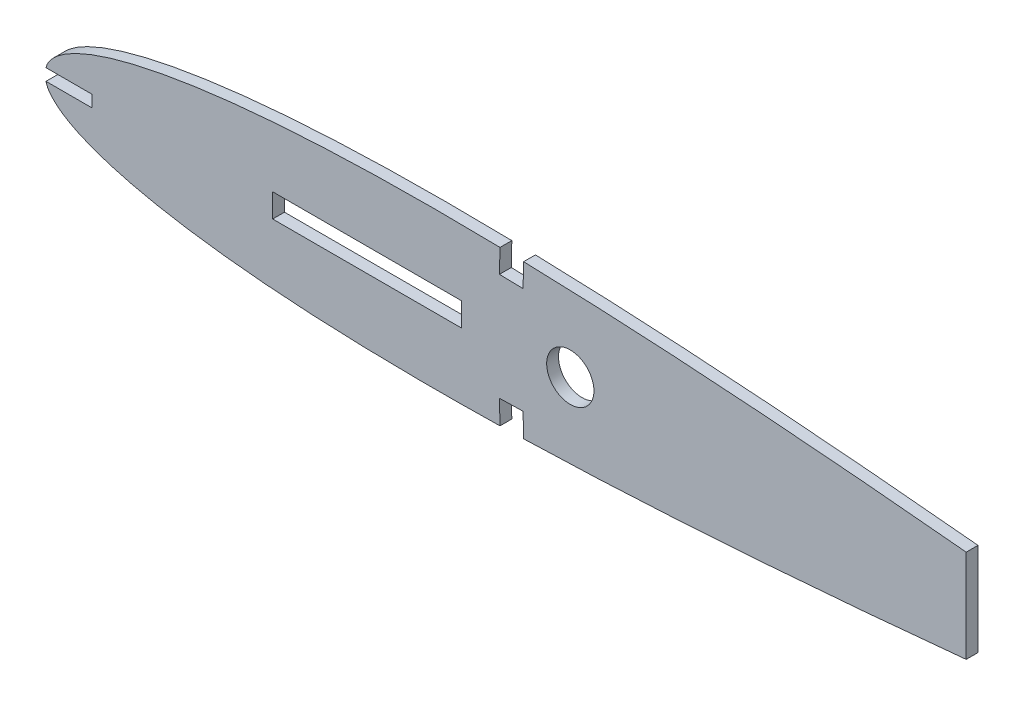
ISO-10303-21;
HEADER;
FILE_DESCRIPTION(('STEP AP214'),'2;1');
FILE_NAME('part.step','',(''),(''),'','','');
FILE_SCHEMA(('AUTOMOTIVE_DESIGN { 1 0 10303 214 1 1 1 1 }'));
ENDSEC;
DATA;
#1=APPLICATION_CONTEXT('core data for automotive mechanical design processes');
#2=APPLICATION_PROTOCOL_DEFINITION('international standard','automotive_design',2000,#1);
#3=PRODUCT_CONTEXT('',#1,'mechanical');
#4=PRODUCT('Part','Part','',(#3));
#5=PRODUCT_RELATED_PRODUCT_CATEGORY('part','',(#4));
#6=PRODUCT_DEFINITION_FORMATION('','',#4);
#7=PRODUCT_DEFINITION_CONTEXT('part definition',#1,'design');
#8=PRODUCT_DEFINITION('design','',#6,#7);
#9=PRODUCT_DEFINITION_SHAPE('','',#8);
#10=(LENGTH_UNIT() NAMED_UNIT(*) SI_UNIT(.MILLI.,.METRE.));
#11=(NAMED_UNIT(*) PLANE_ANGLE_UNIT() SI_UNIT($,.RADIAN.));
#12=(NAMED_UNIT(*) SI_UNIT($,.STERADIAN.) SOLID_ANGLE_UNIT());
#13=UNCERTAINTY_MEASURE_WITH_UNIT(LENGTH_MEASURE(1.E-05),#10,'distance_accuracy_value','');
#14=(GEOMETRIC_REPRESENTATION_CONTEXT(3) GLOBAL_UNCERTAINTY_ASSIGNED_CONTEXT((#13)) GLOBAL_UNIT_ASSIGNED_CONTEXT((#10,
#11,#12)) REPRESENTATION_CONTEXT('',''));
#15=CARTESIAN_POINT('',(0.,0.,0.));
#16=DIRECTION('',(0.,0.,1.));
#17=DIRECTION('',(1.,0.,0.));
#18=AXIS2_PLACEMENT_3D('',#15,#16,#17);
#19=CARTESIAN_POINT('',(0.,0.,3.175));
#20=CARTESIAN_POINT('',(0.115985534802059,-0.824823436018303,3.175));
#21=CARTESIAN_POINT('',(0.364862543708603,-2.59469577382463,3.175));
#22=CARTESIAN_POINT('',(2.22969317329404,-4.97424741823602,3.175));
#23=CARTESIAN_POINT('',(4.98137123964954,-7.17476356535342,3.175));
#24=CARTESIAN_POINT('',(8.77294159508805,-9.24947970106576,3.175));
#25=CARTESIAN_POINT('',(13.5435191774407,-11.2024906751345,3.175));
#26=CARTESIAN_POINT('',(19.2974960213887,-13.0205834501878,3.175));
#27=CARTESIAN_POINT('',(25.9988683661861,-14.6868250170778,3.175));
#28=CARTESIAN_POINT('',(33.6118170782071,-16.1849674426803,3.175));
#29=CARTESIAN_POINT('',(42.0909888876184,-17.4980708306289,3.175));
#30=CARTESIAN_POINT('',(51.3852334657118,-18.6124209383249,3.175));
#31=CARTESIAN_POINT('',(61.4378279271614,-19.5185362955799,3.175));
#32=CARTESIAN_POINT('',(72.1872792194382,-20.2093401026352,3.175));
#33=CARTESIAN_POINT('',(83.56751436261,-20.6827537764749,3.175));
#34=CARTESIAN_POINT('',(95.5084877266096,-20.9400156934708,3.175));
#35=CARTESIAN_POINT('',(107.936696619066,-20.9876471619785,3.175));
#36=CARTESIAN_POINT('',(120.775518049418,-20.8348485852232,3.175));
#37=CARTESIAN_POINT('',(133.946062727329,-20.4937461228791,3.175));
#38=CARTESIAN_POINT('',(147.366939386786,-19.981000511003,3.175));
#39=CARTESIAN_POINT('',(160.955791029869,-19.3133394364877,3.175));
#40=CARTESIAN_POINT('',(174.628693343563,-18.508566702671,3.175));
#41=CARTESIAN_POINT('',(188.301472832485,-17.5870138793066,3.175));
#42=CARTESIAN_POINT('',(201.889886046072,-16.5679498364445,3.175));
#43=CARTESIAN_POINT('',(215.310032455186,-15.470294327225,3.175));
#44=CARTESIAN_POINT('',(228.479451099162,-14.3119446099029,3.175));
#45=CARTESIAN_POINT('',(241.316804274559,-13.1122664299753,3.175));
#46=CARTESIAN_POINT('',(253.743033604296,-11.887008330919,3.175));
#47=CARTESIAN_POINT('',(265.681494766393,-10.6533719228195,3.175));
#48=CARTESIAN_POINT('',(277.058607360279,-9.42727111028594,3.175));
#49=CARTESIAN_POINT('',(287.804163994382,-8.22396630077346,3.175));
#50=CARTESIAN_POINT('',(297.851820226782,-7.0580399063066,3.175));
#51=CARTESIAN_POINT('',(307.139892382437,-5.94572982998584,3.175));
#52=CARTESIAN_POINT('',(315.610665982134,-4.89963732621521,3.175));
#53=CARTESIAN_POINT('',(323.213152208341,-3.93775159154104,3.175));
#54=CARTESIAN_POINT('',(329.896669994559,-3.064968775534,3.175));
#55=CARTESIAN_POINT('',(335.63166517205,-2.31918990164751,3.175));
#56=CARTESIAN_POINT('',(340.34887380594,-1.64076533548796,3.175));
#57=CARTESIAN_POINT('',(344.110866429769,-1.23133082569655,3.175));
#58=CARTESIAN_POINT('',(346.670763267733,-0.635287814967105,3.175));
#59=CARTESIAN_POINT('',(348.546486747565,-0.815947966453893,3.175));
#60=CARTESIAN_POINT('',(349.081845345648,-0.19502894621006,3.175));
#61=CARTESIAN_POINT('',(349.25,0.,3.175));
#62=B_SPLINE_CURVE_WITH_KNOTS('',3,(#19,#20,#21,#22,#23,#24,#25,#26,#27,#28,#29,#30,#31,#32,#33,
#34,#35,#36,#37,#38,#39,#40,#41,#42,#43,#44,#45,#46,#47,#48,#49,#50,#51,#52,#53,#54,#55,#56,#57,
#58,#59,#60,#61),.UNSPECIFIED.,.F.,.F.,(4,1,1,1,1,1,1,1,1,1,1,1,1,1,1,1,1,1,1,1,1,1,1,1,1,1,1,1,
1,1,1,1,1,1,1,1,1,1,1,1,4),(0.,0.00690887819095132,0.014824787780603,0.0245786747262124,
0.0365868011412138,0.0510270804082164,0.0679537271803132,0.0873481546665464,0.109150934661929,
0.133267944172764,0.159584673072264,0.187963463690011,0.218251704826384,0.250281930400473,
0.283870156733695,0.318821997747217,0.354933688380441,0.391987367731552,0.429762919657396,
0.468028540529623,0.506552783072523,0.545097780862577,0.583424682124698,0.621298850837664,
0.658483139040777,0.694749649104267,0.72987052691746,0.763629321442605,0.795816346106627,
0.826229711631338,0.85468110230924,0.880993609524026,0.90500122422466,0.92655519067439,
0.945518651994912,0.961773354231409,0.975215057817464,0.985759966117311,0.993340110835715,
0.997908147241042,1.),.UNSPECIFIED.);
#63=DIRECTION('',(0.,0.,-1.));
#64=VECTOR('',#63,1.);
#65=SURFACE_OF_LINEAR_EXTRUSION('',#62,#64);
#66=CARTESIAN_POINT('',(0.,0.,0.));
#67=CARTESIAN_POINT('',(0.115985534802059,-0.824823436018303,0.));
#68=CARTESIAN_POINT('',(0.364862543708603,-2.59469577382463,0.));
#69=CARTESIAN_POINT('',(2.22969317329404,-4.97424741823602,0.));
#70=CARTESIAN_POINT('',(4.98137123964954,-7.17476356535342,0.));
#71=CARTESIAN_POINT('',(8.77294159508805,-9.24947970106576,0.));
#72=CARTESIAN_POINT('',(13.5435191774407,-11.2024906751345,0.));
#73=CARTESIAN_POINT('',(19.2974960213887,-13.0205834501878,0.));
#74=CARTESIAN_POINT('',(25.9988683661861,-14.6868250170778,0.));
#75=CARTESIAN_POINT('',(33.6118170782071,-16.1849674426803,0.));
#76=CARTESIAN_POINT('',(42.0909888876184,-17.4980708306289,0.));
#77=CARTESIAN_POINT('',(51.3852334657118,-18.6124209383249,0.));
#78=CARTESIAN_POINT('',(61.4378279271614,-19.5185362955799,0.));
#79=CARTESIAN_POINT('',(72.1872792194382,-20.2093401026352,0.));
#80=CARTESIAN_POINT('',(83.56751436261,-20.6827537764749,0.));
#81=CARTESIAN_POINT('',(95.5084877266096,-20.9400156934708,0.));
#82=CARTESIAN_POINT('',(107.936696619066,-20.9876471619785,0.));
#83=CARTESIAN_POINT('',(120.775518049418,-20.8348485852232,0.));
#84=CARTESIAN_POINT('',(133.946062727329,-20.4937461228791,0.));
#85=CARTESIAN_POINT('',(147.366939386786,-19.981000511003,0.));
#86=CARTESIAN_POINT('',(160.955791029869,-19.3133394364877,0.));
#87=CARTESIAN_POINT('',(174.628693343563,-18.508566702671,0.));
#88=CARTESIAN_POINT('',(188.301472832485,-17.5870138793066,0.));
#89=CARTESIAN_POINT('',(201.889886046072,-16.5679498364445,0.));
#90=CARTESIAN_POINT('',(215.310032455186,-15.470294327225,0.));
#91=CARTESIAN_POINT('',(228.479451099162,-14.3119446099029,0.));
#92=CARTESIAN_POINT('',(241.316804274559,-13.1122664299753,0.));
#93=CARTESIAN_POINT('',(253.743033604296,-11.887008330919,0.));
#94=CARTESIAN_POINT('',(265.681494766393,-10.6533719228195,0.));
#95=CARTESIAN_POINT('',(277.058607360279,-9.42727111028594,0.));
#96=CARTESIAN_POINT('',(287.804163994382,-8.22396630077346,0.));
#97=CARTESIAN_POINT('',(297.851820226782,-7.0580399063066,0.));
#98=CARTESIAN_POINT('',(307.139892382437,-5.94572982998584,0.));
#99=CARTESIAN_POINT('',(315.610665982134,-4.89963732621521,0.));
#100=CARTESIAN_POINT('',(323.213152208341,-3.93775159154104,0.));
#101=CARTESIAN_POINT('',(329.896669994559,-3.064968775534,0.));
#102=CARTESIAN_POINT('',(335.63166517205,-2.31918990164751,0.));
#103=CARTESIAN_POINT('',(340.34887380594,-1.64076533548796,0.));
#104=CARTESIAN_POINT('',(344.110866429769,-1.23133082569655,0.));
#105=CARTESIAN_POINT('',(346.670763267733,-0.635287814967105,0.));
#106=CARTESIAN_POINT('',(348.546486747565,-0.815947966453893,0.));
#107=CARTESIAN_POINT('',(349.081845345648,-0.19502894621006,0.));
#108=CARTESIAN_POINT('',(349.25,0.,0.));
#109=B_SPLINE_CURVE_WITH_KNOTS('',3,(#66,#67,#68,#69,#70,#71,#72,#73,#74,#75,#76,#77,#78,#79,
#80,#81,#82,#83,#84,#85,#86,#87,#88,#89,#90,#91,#92,#93,#94,#95,#96,#97,#98,#99,#100,#101,#102,
#103,#104,#105,#106,#107,#108),.UNSPECIFIED.,.F.,.F.,(4,1,1,1,1,1,1,1,1,1,1,1,1,1,1,1,1,1,1,1,1,
1,1,1,1,1,1,1,1,1,1,1,1,1,1,1,1,1,1,1,4),(0.,0.00690887819095132,0.014824787780603,
0.0245786747262124,0.0365868011412138,0.0510270804082164,0.0679537271803132,0.0873481546665464,
0.109150934661929,0.133267944172764,0.159584673072264,0.187963463690011,0.218251704826384,
0.250281930400473,0.283870156733695,0.318821997747217,0.354933688380441,0.391987367731552,
0.429762919657396,0.468028540529623,0.506552783072523,0.545097780862577,0.583424682124698,
0.621298850837664,0.658483139040777,0.694749649104267,0.72987052691746,0.763629321442605,
0.795816346106627,0.826229711631338,0.85468110230924,0.880993609524026,0.90500122422466,
0.92655519067439,0.945518651994912,0.961773354231409,0.975215057817464,0.985759966117311,
0.993340110835715,0.997908147241042,1.),.UNSPECIFIED.);
#110=CARTESIAN_POINT('',(0.278181832771451,-1.5875,0.));
#111=VERTEX_POINT('',#110);
#112=CARTESIAN_POINT('',(122.327232824904,-20.7737889965541,0.));
#113=VERTEX_POINT('',#112);
#114=EDGE_CURVE('E409',#111,#113,#109,.T.);
#115=ORIENTED_EDGE('',*,*,#114,.T.);
#116=DIRECTION('',(0.,0.,-1.));
#117=VECTOR('',#116,1.);
#118=CARTESIAN_POINT('',(122.327232824903,-20.7737889965238,3.175));
#119=LINE('',#118,#117);
#120=CARTESIAN_POINT('',(122.327232824904,-20.7737889965541,3.175));
#121=VERTEX_POINT('',#120);
#122=EDGE_CURVE('E278',#113,#121,#119,.F.);
#123=ORIENTED_EDGE('',*,*,#122,.T.);
#124=CARTESIAN_POINT('',(0.278181832771451,-1.5875,3.175));
#125=VERTEX_POINT('',#124);
#126=EDGE_CURVE('E305',#125,#121,#62,.T.);
#127=ORIENTED_EDGE('',*,*,#126,.F.);
#128=DIRECTION('',(0.,0.,-1.));
#129=VECTOR('',#128,1.);
#130=CARTESIAN_POINT('',(0.27818183256063,-1.5875,3.175));
#131=LINE('',#130,#129);
#132=EDGE_CURVE('E211',#125,#111,#131,.T.);
#133=ORIENTED_EDGE('',*,*,#132,.T.);
#134=EDGE_LOOP('',(#115,#123,#127,#133));
#135=FACE_BOUND('',#134,.T.);
#136=ADVANCED_FACE('F45',(#135),#65,.F.);
#137=CARTESIAN_POINT('',(349.25,0.,3.175));
#138=CARTESIAN_POINT('',(349.081845345649,0.195028946210054,3.175));
#139=CARTESIAN_POINT('',(348.546486747564,0.815947966453887,3.175));
#140=CARTESIAN_POINT('',(346.670763267733,0.635287814967099,3.175));
#141=CARTESIAN_POINT('',(344.110866429769,1.23133082569654,3.175));
#142=CARTESIAN_POINT('',(340.34887380594,1.64076533548795,3.175));
#143=CARTESIAN_POINT('',(335.63166517205,2.3191899016475,3.175));
#144=CARTESIAN_POINT('',(329.896669994558,3.06496877553399,3.175));
#145=CARTESIAN_POINT('',(323.213152208341,3.93775159154102,3.175));
#146=CARTESIAN_POINT('',(315.610665982132,4.8996373262152,3.175));
#147=CARTESIAN_POINT('',(307.139892382437,5.94572982998583,3.175));
#148=CARTESIAN_POINT('',(297.851820226782,7.05803990630659,3.175));
#149=CARTESIAN_POINT('',(287.804163994382,8.22396630077345,3.175));
#150=CARTESIAN_POINT('',(277.058607360279,9.42727111028591,3.175));
#151=CARTESIAN_POINT('',(265.681494766393,10.6533719228194,3.175));
#152=CARTESIAN_POINT('',(253.743033604296,11.887008330919,3.175));
#153=CARTESIAN_POINT('',(241.316804274558,13.1122664299753,3.175));
#154=CARTESIAN_POINT('',(228.479451099162,14.3119446099029,3.175));
#155=CARTESIAN_POINT('',(215.310032455185,15.470294327225,3.175));
#156=CARTESIAN_POINT('',(201.889886046072,16.5679498364445,3.175));
#157=CARTESIAN_POINT('',(188.301472832485,17.5870138793065,3.175));
#158=CARTESIAN_POINT('',(174.628693343563,18.5085667026709,3.175));
#159=CARTESIAN_POINT('',(160.955791029868,19.3133394364876,3.175));
#160=CARTESIAN_POINT('',(147.366939386786,19.9810005110029,3.175));
#161=CARTESIAN_POINT('',(133.946062727329,20.4937461228791,3.175));
#162=CARTESIAN_POINT('',(120.775518049417,20.8348485852232,3.175));
#163=CARTESIAN_POINT('',(107.936696619066,20.9876471619784,3.175));
#164=CARTESIAN_POINT('',(95.5084877266094,20.9400156934707,3.175));
#165=CARTESIAN_POINT('',(83.5675143626098,20.6827537764748,3.175));
#166=CARTESIAN_POINT('',(72.187279219438,20.2093401026351,3.175));
#167=CARTESIAN_POINT('',(61.4378279271613,19.5185362955799,3.175));
#168=CARTESIAN_POINT('',(51.3852334657117,18.6124209383248,3.175));
#169=CARTESIAN_POINT('',(42.0909888876183,17.4980708306289,3.175));
#170=CARTESIAN_POINT('',(33.611817078207,16.1849674426803,3.175));
#171=CARTESIAN_POINT('',(25.9988683661861,14.6868250170778,3.175));
#172=CARTESIAN_POINT('',(19.2974960213886,13.0205834501878,3.175));
#173=CARTESIAN_POINT('',(13.5435191774407,11.2024906751345,3.175));
#174=CARTESIAN_POINT('',(8.77294159508802,9.24947970106573,3.175));
#175=CARTESIAN_POINT('',(4.98137123964953,7.17476356535341,3.175));
#176=CARTESIAN_POINT('',(2.22969317329403,4.97424741823602,3.175));
#177=CARTESIAN_POINT('',(0.364862543708601,2.59469577382463,3.175));
#178=CARTESIAN_POINT('',(0.115985534802059,0.824823436018293,3.175));
#179=CARTESIAN_POINT('',(0.,0.,3.175));
#180=B_SPLINE_CURVE_WITH_KNOTS('',3,(#137,#138,#139,#140,#141,#142,#143,#144,#145,#146,#147,
#148,#149,#150,#151,#152,#153,#154,#155,#156,#157,#158,#159,#160,#161,#162,#163,#164,#165,#166,
#167,#168,#169,#170,#171,#172,#173,#174,#175,#176,#177,#178,#179),.UNSPECIFIED.,.F.,.F.,(4,1,1,
1,1,1,1,1,1,1,1,1,1,1,1,1,1,1,1,1,1,1,1,1,1,1,1,1,1,1,1,1,1,1,1,1,1,1,1,1,4),(0.,
0.00209185275895771,0.00665988916428452,0.0142400338826894,0.0247849421825357,
0.0382266457685912,0.0544813480050881,0.0734448093256102,0.0949987757753401,0.119006390475974,
0.14531889769076,0.173770288368662,0.204183653893373,0.236370678557395,0.27012947308254,
0.305250350895733,0.341516860959223,0.378701149162336,0.416575317875302,0.454902219137423,
0.493447216927477,0.531971459470377,0.570237080342604,0.608012632268448,0.645066311619559,
0.681178002252783,0.716129843266305,0.749718069599527,0.781748295173616,0.812036536309989,
0.840415326927736,0.866732055827236,0.890849065338071,0.912651845333454,0.932046272819687,
0.948972919591784,0.963413198858786,0.975421325273788,0.985175212219397,0.993091121809049,1.),.UNSPECIFIED.);
#181=DIRECTION('',(0.,0.,-1.));
#182=VECTOR('',#181,1.);
#183=SURFACE_OF_LINEAR_EXTRUSION('',#180,#182);
#184=CARTESIAN_POINT('',(247.65,12.485229976577,3.175));
#185=VERTEX_POINT('',#184);
#186=CARTESIAN_POINT('',(128.675427044537,20.6223619520034,3.175));
#187=VERTEX_POINT('',#186);
#188=EDGE_CURVE('E317',#185,#187,#180,.T.);
#189=ORIENTED_EDGE('',*,*,#188,.F.);
#190=DIRECTION('',(0.,0.,-1.));
#191=VECTOR('',#190,1.);
#192=CARTESIAN_POINT('',(247.65,12.4852299762647,3.175));
#193=LINE('',#192,#191);
#194=CARTESIAN_POINT('',(247.65,12.485229976577,0.));
#195=VERTEX_POINT('',#194);
#196=EDGE_CURVE('E290',#185,#195,#193,.T.);
#197=ORIENTED_EDGE('',*,*,#196,.T.);
#198=CARTESIAN_POINT('',(349.25,0.,0.));
#199=CARTESIAN_POINT('',(349.081845345649,0.195028946210054,0.));
#200=CARTESIAN_POINT('',(348.546486747564,0.815947966453887,0.));
#201=CARTESIAN_POINT('',(346.670763267733,0.635287814967099,0.));
#202=CARTESIAN_POINT('',(344.110866429769,1.23133082569654,0.));
#203=CARTESIAN_POINT('',(340.34887380594,1.64076533548795,0.));
#204=CARTESIAN_POINT('',(335.63166517205,2.3191899016475,0.));
#205=CARTESIAN_POINT('',(329.896669994558,3.06496877553399,0.));
#206=CARTESIAN_POINT('',(323.213152208341,3.93775159154102,0.));
#207=CARTESIAN_POINT('',(315.610665982132,4.8996373262152,0.));
#208=CARTESIAN_POINT('',(307.139892382437,5.94572982998583,0.));
#209=CARTESIAN_POINT('',(297.851820226782,7.05803990630659,0.));
#210=CARTESIAN_POINT('',(287.804163994382,8.22396630077345,0.));
#211=CARTESIAN_POINT('',(277.058607360279,9.42727111028591,0.));
#212=CARTESIAN_POINT('',(265.681494766393,10.6533719228194,0.));
#213=CARTESIAN_POINT('',(253.743033604296,11.887008330919,0.));
#214=CARTESIAN_POINT('',(241.316804274558,13.1122664299753,0.));
#215=CARTESIAN_POINT('',(228.479451099162,14.3119446099029,0.));
#216=CARTESIAN_POINT('',(215.310032455185,15.470294327225,0.));
#217=CARTESIAN_POINT('',(201.889886046072,16.5679498364445,0.));
#218=CARTESIAN_POINT('',(188.301472832485,17.5870138793065,0.));
#219=CARTESIAN_POINT('',(174.628693343563,18.5085667026709,0.));
#220=CARTESIAN_POINT('',(160.955791029868,19.3133394364876,0.));
#221=CARTESIAN_POINT('',(147.366939386786,19.9810005110029,0.));
#222=CARTESIAN_POINT('',(133.946062727329,20.4937461228791,0.));
#223=CARTESIAN_POINT('',(120.775518049417,20.8348485852232,0.));
#224=CARTESIAN_POINT('',(107.936696619066,20.9876471619784,0.));
#225=CARTESIAN_POINT('',(95.5084877266094,20.9400156934707,0.));
#226=CARTESIAN_POINT('',(83.5675143626098,20.6827537764748,0.));
#227=CARTESIAN_POINT('',(72.187279219438,20.2093401026351,0.));
#228=CARTESIAN_POINT('',(61.4378279271613,19.5185362955799,0.));
#229=CARTESIAN_POINT('',(51.3852334657117,18.6124209383248,0.));
#230=CARTESIAN_POINT('',(42.0909888876183,17.4980708306289,0.));
#231=CARTESIAN_POINT('',(33.611817078207,16.1849674426803,0.));
#232=CARTESIAN_POINT('',(25.9988683661861,14.6868250170778,0.));
#233=CARTESIAN_POINT('',(19.2974960213886,13.0205834501878,0.));
#234=CARTESIAN_POINT('',(13.5435191774407,11.2024906751345,0.));
#235=CARTESIAN_POINT('',(8.77294159508802,9.24947970106573,0.));
#236=CARTESIAN_POINT('',(4.98137123964953,7.17476356535341,0.));
#237=CARTESIAN_POINT('',(2.22969317329403,4.97424741823602,0.));
#238=CARTESIAN_POINT('',(0.364862543708601,2.59469577382463,0.));
#239=CARTESIAN_POINT('',(0.115985534802059,0.824823436018293,0.));
#240=CARTESIAN_POINT('',(0.,0.,0.));
#241=B_SPLINE_CURVE_WITH_KNOTS('',3,(#198,#199,#200,#201,#202,#203,#204,#205,#206,#207,#208,
#209,#210,#211,#212,#213,#214,#215,#216,#217,#218,#219,#220,#221,#222,#223,#224,#225,#226,#227,
#228,#229,#230,#231,#232,#233,#234,#235,#236,#237,#238,#239,#240),.UNSPECIFIED.,.F.,.F.,(4,1,1,
1,1,1,1,1,1,1,1,1,1,1,1,1,1,1,1,1,1,1,1,1,1,1,1,1,1,1,1,1,1,1,1,1,1,1,1,1,4),(0.,
0.00209185275895771,0.00665988916428452,0.0142400338826894,0.0247849421825357,
0.0382266457685912,0.0544813480050881,0.0734448093256102,0.0949987757753401,0.119006390475974,
0.14531889769076,0.173770288368662,0.204183653893373,0.236370678557395,0.27012947308254,
0.305250350895733,0.341516860959223,0.378701149162336,0.416575317875302,0.454902219137423,
0.493447216927477,0.531971459470377,0.570237080342604,0.608012632268448,0.645066311619559,
0.681178002252783,0.716129843266305,0.749718069599527,0.781748295173616,0.812036536309989,
0.840415326927736,0.866732055827236,0.890849065338071,0.912651845333454,0.932046272819687,
0.948972919591784,0.963413198858786,0.975421325273788,0.985175212219397,0.993091121809049,1.),.UNSPECIFIED.);
#242=CARTESIAN_POINT('',(128.675427044537,20.6223619520034,0.));
#243=VERTEX_POINT('',#242);
#244=EDGE_CURVE('E306',#195,#243,#241,.T.);
#245=ORIENTED_EDGE('',*,*,#244,.T.);
#246=DIRECTION('',(0.,0.,-1.));
#247=VECTOR('',#246,1.);
#248=CARTESIAN_POINT('',(128.675427044536,20.6223619519876,3.175));
#249=LINE('',#248,#247);
#250=EDGE_CURVE('E286',#243,#187,#249,.F.);
#251=ORIENTED_EDGE('',*,*,#250,.T.);
#252=EDGE_LOOP('',(#189,#197,#245,#251));
#253=FACE_BOUND('',#252,.T.);
#254=ADVANCED_FACE('F328',(#253),#183,.F.);
#255=CARTESIAN_POINT('',(128.675427044536,-20.6223619519876,0.));
#256=VERTEX_POINT('',#255);
#257=CARTESIAN_POINT('',(247.650000009448,-12.4852299753336,0.));
#258=VERTEX_POINT('',#257);
#259=EDGE_CURVE('E297',#256,#258,#109,.T.);
#260=ORIENTED_EDGE('',*,*,#259,.T.);
#261=DIRECTION('',(0.,0.,-1.));
#262=VECTOR('',#261,1.);
#263=CARTESIAN_POINT('',(247.65,-12.4852299762648,3.175));
#264=LINE('',#263,#262);
#265=CARTESIAN_POINT('',(247.65,-12.4852299753336,3.175));
#266=VERTEX_POINT('',#265);
#267=EDGE_CURVE('E294',#258,#266,#264,.F.);
#268=ORIENTED_EDGE('',*,*,#267,.T.);
#269=CARTESIAN_POINT('',(128.675427044536,-20.6223619519876,3.175));
#270=VERTEX_POINT('',#269);
#271=EDGE_CURVE('E298',#270,#266,#62,.T.);
#272=ORIENTED_EDGE('',*,*,#271,.F.);
#273=DIRECTION('',(0.,0.,-1.));
#274=VECTOR('',#273,1.);
#275=CARTESIAN_POINT('',(128.675427044536,-20.6223619519876,3.175));
#276=LINE('',#275,#274);
#277=EDGE_CURVE('E274',#270,#256,#276,.T.);
#278=ORIENTED_EDGE('',*,*,#277,.T.);
#279=EDGE_LOOP('',(#260,#268,#272,#278));
#280=FACE_BOUND('',#279,.T.);
#281=ADVANCED_FACE('F47',(#280),#65,.F.);
#282=CARTESIAN_POINT('',(122.327232824903,20.7737889965008,3.175));
#283=VERTEX_POINT('',#282);
#284=CARTESIAN_POINT('',(0.278181832771451,1.5875,3.175));
#285=VERTEX_POINT('',#284);
#286=EDGE_CURVE('E307',#283,#285,#180,.T.);
#287=ORIENTED_EDGE('',*,*,#286,.F.);
#288=DIRECTION('',(0.,0.,-1.));
#289=VECTOR('',#288,1.);
#290=CARTESIAN_POINT('',(122.327232824903,20.7737889965238,3.175));
#291=LINE('',#290,#289);
#292=CARTESIAN_POINT('',(122.327232824903,20.7737889965008,0.));
#293=VERTEX_POINT('',#292);
#294=EDGE_CURVE('E282',#283,#293,#291,.T.);
#295=ORIENTED_EDGE('',*,*,#294,.T.);
#296=CARTESIAN_POINT('',(0.278181832771451,1.5875,0.));
#297=VERTEX_POINT('',#296);
#298=EDGE_CURVE('E411',#293,#297,#241,.T.);
#299=ORIENTED_EDGE('',*,*,#298,.T.);
#300=DIRECTION('',(0.,0.,-1.));
#301=VECTOR('',#300,1.);
#302=CARTESIAN_POINT('',(0.278181832560628,1.58749999999999,3.175));
#303=LINE('',#302,#301);
#304=EDGE_CURVE('E269',#297,#285,#303,.F.);
#305=ORIENTED_EDGE('',*,*,#304,.T.);
#306=EDGE_LOOP('',(#287,#295,#299,#305));
#307=FACE_BOUND('',#306,.T.);
#308=ADVANCED_FACE('F324',(#307),#183,.F.);
#309=CARTESIAN_POINT('',(172.295032653064,-18.6346740274407,3.175));
#310=DIRECTION('',(0.,0.,1.));
#311=DIRECTION('',(1.,0.,0.));
#312=AXIS2_PLACEMENT_3D('',#309,#310,#311);
#313=PLANE('',#312);
#314=DIRECTION('',(0.,-1.,0.));
#315=VECTOR('',#314,1.);
#316=CARTESIAN_POINT('',(61.214,3.175,3.175));
#317=LINE('',#316,#315);
#318=CARTESIAN_POINT('',(61.214,3.175,3.175));
#319=VERTEX_POINT('',#318);
#320=CARTESIAN_POINT('',(61.214,-3.175,3.175));
#321=VERTEX_POINT('',#320);
#322=EDGE_CURVE('E62',#319,#321,#317,.T.);
#323=ORIENTED_EDGE('',*,*,#322,.F.);
#324=DIRECTION('',(-1.,0.,0.));
#325=VECTOR('',#324,1.);
#326=CARTESIAN_POINT('',(61.214,3.175,3.175));
#327=LINE('',#326,#325);
#328=CARTESIAN_POINT('',(112.014,3.175,3.175));
#329=VERTEX_POINT('',#328);
#330=EDGE_CURVE('E193',#329,#319,#327,.T.);
#331=ORIENTED_EDGE('',*,*,#330,.F.);
#332=DIRECTION('',(0.,1.,0.));
#333=VECTOR('',#332,1.);
#334=CARTESIAN_POINT('',(112.014,3.175,3.175));
#335=LINE('',#334,#333);
#336=CARTESIAN_POINT('',(112.014,-3.175,3.175));
#337=VERTEX_POINT('',#336);
#338=EDGE_CURVE('E175',#337,#329,#335,.T.);
#339=ORIENTED_EDGE('',*,*,#338,.F.);
#340=DIRECTION('',(1.,0.,0.));
#341=VECTOR('',#340,1.);
#342=CARTESIAN_POINT('',(61.214,-3.175,3.175));
#343=LINE('',#342,#341);
#344=EDGE_CURVE('E185',#321,#337,#343,.T.);
#345=ORIENTED_EDGE('',*,*,#344,.F.);
#346=EDGE_LOOP('',(#323,#331,#339,#345));
#347=FACE_BOUND('',#346,.T.);
#348=DIRECTION('',(0.,-1.,0.));
#349=VECTOR('',#348,1.);
#350=CARTESIAN_POINT('',(247.65,50.8,3.175));
#351=LINE('',#350,#349);
#352=EDGE_CURVE('E208',#185,#266,#351,.T.);
#353=ORIENTED_EDGE('',*,*,#352,.F.);
#354=ORIENTED_EDGE('',*,*,#188,.T.);
#355=DIRECTION('',(0.0238467786671199,0.99971562513907,0.));
#356=VECTOR('',#355,1.);
#357=CARTESIAN_POINT('',(128.675427044536,20.6223619519876,3.175));
#358=LINE('',#357,#356);
#359=CARTESIAN_POINT('',(128.524,14.2741677323545,3.175));
#360=VERTEX_POINT('',#359);
#361=EDGE_CURVE('E239',#360,#187,#358,.T.);
#362=ORIENTED_EDGE('',*,*,#361,.F.);
#363=DIRECTION('',(0.99971562513907,-0.0238467786671225,0.));
#364=VECTOR('',#363,1.);
#365=CARTESIAN_POINT('',(128.524,14.2741677323545,3.175));
#366=LINE('',#365,#364);
#367=CARTESIAN_POINT('',(122.175805780367,14.4255947768907,3.175));
#368=VERTEX_POINT('',#367);
#369=EDGE_CURVE('E235',#368,#360,#366,.T.);
#370=ORIENTED_EDGE('',*,*,#369,.F.);
#371=DIRECTION('',(-0.0238467786671209,-0.99971562513907,0.));
#372=VECTOR('',#371,1.);
#373=CARTESIAN_POINT('',(122.175805780367,14.4255947768907,3.175));
#374=LINE('',#373,#372);
#375=EDGE_CURVE('E203',#283,#368,#374,.T.);
#376=ORIENTED_EDGE('',*,*,#375,.F.);
#377=ORIENTED_EDGE('',*,*,#286,.T.);
#378=DIRECTION('',(-1.,0.,0.));
#379=VECTOR('',#378,1.);
#380=CARTESIAN_POINT('',(0.,1.5875,3.175));
#381=LINE('',#380,#379);
#382=CARTESIAN_POINT('',(12.7,1.5875,3.175));
#383=VERTEX_POINT('',#382);
#384=EDGE_CURVE('E255',#383,#285,#381,.T.);
#385=ORIENTED_EDGE('',*,*,#384,.F.);
#386=DIRECTION('',(0.,1.,0.));
#387=VECTOR('',#386,1.);
#388=CARTESIAN_POINT('',(12.7,1.5875,3.175));
#389=LINE('',#388,#387);
#390=CARTESIAN_POINT('',(12.7,-1.5875,3.175));
#391=VERTEX_POINT('',#390);
#392=EDGE_CURVE('E251',#391,#383,#389,.T.);
#393=ORIENTED_EDGE('',*,*,#392,.F.);
#394=DIRECTION('',(1.,0.,0.));
#395=VECTOR('',#394,1.);
#396=CARTESIAN_POINT('',(0.,-1.5875,3.175));
#397=LINE('',#396,#395);
#398=EDGE_CURVE('E247',#125,#391,#397,.T.);
#399=ORIENTED_EDGE('',*,*,#398,.F.);
#400=ORIENTED_EDGE('',*,*,#126,.T.);
#401=DIRECTION('',(0.023846778667122,-0.99971562513907,0.));
#402=VECTOR('',#401,1.);
#403=CARTESIAN_POINT('',(122.327232824903,-20.7737889965238,3.175));
#404=LINE('',#403,#402);
#405=CARTESIAN_POINT('',(122.175805780367,-14.4255947768907,3.175));
#406=VERTEX_POINT('',#405);
#407=EDGE_CURVE('E222',#406,#121,#404,.T.);
#408=ORIENTED_EDGE('',*,*,#407,.F.);
#409=DIRECTION('',(-0.99971562513907,-0.0238467786671225,0.));
#410=VECTOR('',#409,1.);
#411=CARTESIAN_POINT('',(128.524,-14.2741677323545,3.175));
#412=LINE('',#411,#410);
#413=CARTESIAN_POINT('',(128.524,-14.2741677323545,3.175));
#414=VERTEX_POINT('',#413);
#415=EDGE_CURVE('E217',#414,#406,#412,.T.);
#416=ORIENTED_EDGE('',*,*,#415,.F.);
#417=DIRECTION('',(-0.0238467786671209,0.99971562513907,0.));
#418=VECTOR('',#417,1.);
#419=CARTESIAN_POINT('',(128.675427044536,-20.6223619519876,3.175));
#420=LINE('',#419,#418);
#421=EDGE_CURVE('E213',#270,#414,#420,.T.);
#422=ORIENTED_EDGE('',*,*,#421,.F.);
#423=ORIENTED_EDGE('',*,*,#271,.T.);
#424=EDGE_LOOP('',(#353,#354,#362,#370,#376,#377,#385,#393,#399,#400,#408,#416,#422,#423));
#425=FACE_BOUND('',#424,.T.);
#426=CARTESIAN_POINT('',(141.224,0.,3.175));
#427=DIRECTION('',(0.,0.,1.));
#428=DIRECTION('',(1.,0.,0.));
#429=AXIS2_PLACEMENT_3D('',#426,#427,#428);
#430=CIRCLE('',#429,6.35);
#431=CARTESIAN_POINT('',(147.574,0.,3.175));
#432=VERTEX_POINT('',#431);
#433=EDGE_CURVE('E229',#432,#432,#430,.T.);
#434=ORIENTED_EDGE('',*,*,#433,.F.);
#435=EDGE_LOOP('',(#434));
#436=FACE_BOUND('',#435,.T.);
#437=ADVANCED_FACE('F190',(#347,#425,#436),#313,.T.);
#438=CARTESIAN_POINT('',(172.295032653064,-18.6346740274407,0.));
#439=DIRECTION('',(0.,0.,1.));
#440=DIRECTION('',(1.,0.,0.));
#441=AXIS2_PLACEMENT_3D('',#438,#439,#440);
#442=PLANE('',#441);
#443=DIRECTION('',(-1.,0.,0.));
#444=VECTOR('',#443,1.);
#445=CARTESIAN_POINT('',(172.295032653064,3.175,0.));
#446=LINE('',#445,#444);
#447=CARTESIAN_POINT('',(112.014,3.175,0.));
#448=VERTEX_POINT('',#447);
#449=CARTESIAN_POINT('',(61.214,3.175,0.));
#450=VERTEX_POINT('',#449);
#451=EDGE_CURVE('E55',#448,#450,#446,.T.);
#452=ORIENTED_EDGE('',*,*,#451,.T.);
#453=DIRECTION('',(0.,-1.,0.));
#454=VECTOR('',#453,1.);
#455=CARTESIAN_POINT('',(61.214,-18.6346740274407,0.));
#456=LINE('',#455,#454);
#457=CARTESIAN_POINT('',(61.214,-3.175,0.));
#458=VERTEX_POINT('',#457);
#459=EDGE_CURVE('E11',#450,#458,#456,.T.);
#460=ORIENTED_EDGE('',*,*,#459,.T.);
#461=DIRECTION('',(1.,0.,0.));
#462=VECTOR('',#461,1.);
#463=CARTESIAN_POINT('',(172.295032653064,-3.175,0.));
#464=LINE('',#463,#462);
#465=CARTESIAN_POINT('',(112.014,-3.175,0.));
#466=VERTEX_POINT('',#465);
#467=EDGE_CURVE('E465',#458,#466,#464,.T.);
#468=ORIENTED_EDGE('',*,*,#467,.T.);
#469=DIRECTION('',(0.,1.,0.));
#470=VECTOR('',#469,1.);
#471=CARTESIAN_POINT('',(112.014,-18.6346740274407,0.));
#472=LINE('',#471,#470);
#473=EDGE_CURVE('E178',#466,#448,#472,.T.);
#474=ORIENTED_EDGE('',*,*,#473,.T.);
#475=EDGE_LOOP('',(#452,#460,#468,#474));
#476=FACE_BOUND('',#475,.T.);
#477=CARTESIAN_POINT('',(141.224,0.,0.));
#478=DIRECTION('',(0.,0.,1.));
#479=DIRECTION('',(1.,0.,0.));
#480=AXIS2_PLACEMENT_3D('',#477,#478,#479);
#481=CIRCLE('',#480,6.35);
#482=CARTESIAN_POINT('',(147.574,0.,0.));
#483=VERTEX_POINT('',#482);
#484=EDGE_CURVE('E273',#483,#483,#481,.T.);
#485=ORIENTED_EDGE('',*,*,#484,.T.);
#486=EDGE_LOOP('',(#485));
#487=FACE_BOUND('',#486,.T.);
#488=ORIENTED_EDGE('',*,*,#244,.F.);
#489=DIRECTION('',(0.,-1.,0.));
#490=VECTOR('',#489,1.);
#491=CARTESIAN_POINT('',(247.65,-18.6346740274407,0.));
#492=LINE('',#491,#490);
#493=EDGE_CURVE('E462',#195,#258,#492,.T.);
#494=ORIENTED_EDGE('',*,*,#493,.T.);
#495=ORIENTED_EDGE('',*,*,#259,.F.);
#496=DIRECTION('',(-0.0238467786671209,0.99971562513907,0.));
#497=VECTOR('',#496,1.);
#498=CARTESIAN_POINT('',(128.652845680977,-19.6756956410897,0.));
#499=LINE('',#498,#497);
#500=CARTESIAN_POINT('',(128.524,-14.2741677323545,0.));
#501=VERTEX_POINT('',#500);
#502=EDGE_CURVE('E436',#256,#501,#499,.T.);
#503=ORIENTED_EDGE('',*,*,#502,.T.);
#504=DIRECTION('',(-0.99971562513907,-0.0238467786671225,0.));
#505=VECTOR('',#504,1.);
#506=CARTESIAN_POINT('',(172.166186972087,-13.2331461187054,0.));
#507=LINE('',#506,#505);
#508=CARTESIAN_POINT('',(122.175805780367,-14.4255947768907,0.));
#509=VERTEX_POINT('',#508);
#510=EDGE_CURVE('E442',#501,#509,#507,.T.);
#511=ORIENTED_EDGE('',*,*,#510,.T.);
#512=DIRECTION('',(0.023846778667122,-0.99971562513907,0.));
#513=VECTOR('',#512,1.);
#514=CARTESIAN_POINT('',(122.304651461343,-19.827122685626,0.));
#515=LINE('',#514,#513);
#516=EDGE_CURVE('E446',#509,#113,#515,.T.);
#517=ORIENTED_EDGE('',*,*,#516,.T.);
#518=ORIENTED_EDGE('',*,*,#114,.F.);
#519=DIRECTION('',(1.,0.,0.));
#520=VECTOR('',#519,1.);
#521=CARTESIAN_POINT('',(172.295032653064,-1.5875,0.));
#522=LINE('',#521,#520);
#523=CARTESIAN_POINT('',(12.7,-1.5875,0.));
#524=VERTEX_POINT('',#523);
#525=EDGE_CURVE('E421',#111,#524,#522,.T.);
#526=ORIENTED_EDGE('',*,*,#525,.T.);
#527=DIRECTION('',(0.,1.,0.));
#528=VECTOR('',#527,1.);
#529=CARTESIAN_POINT('',(12.7,-18.6346740274407,0.));
#530=LINE('',#529,#528);
#531=CARTESIAN_POINT('',(12.7,1.5875,0.));
#532=VERTEX_POINT('',#531);
#533=EDGE_CURVE('E428',#524,#532,#530,.T.);
#534=ORIENTED_EDGE('',*,*,#533,.T.);
#535=DIRECTION('',(-1.,0.,0.));
#536=VECTOR('',#535,1.);
#537=CARTESIAN_POINT('',(172.295032653064,1.58749999999999,0.));
#538=LINE('',#537,#536);
#539=EDGE_CURVE('E432',#532,#297,#538,.T.);
#540=ORIENTED_EDGE('',*,*,#539,.T.);
#541=ORIENTED_EDGE('',*,*,#298,.F.);
#542=DIRECTION('',(-0.0238467786671209,-0.99971562513907,0.));
#543=VECTOR('',#542,1.);
#544=CARTESIAN_POINT('',(121.416150306476,-17.4210314518524,0.));
#545=LINE('',#544,#543);
#546=CARTESIAN_POINT('',(122.175805780367,14.4255947768907,0.));
#547=VERTEX_POINT('',#546);
#548=EDGE_CURVE('E450',#293,#547,#545,.T.);
#549=ORIENTED_EDGE('',*,*,#548,.T.);
#550=DIRECTION('',(0.99971562513907,-0.0238467786671225,0.));
#551=VECTOR('',#550,1.);
#552=CARTESIAN_POINT('',(173.054688126955,13.2119522013024,0.));
#553=LINE('',#552,#551);
#554=CARTESIAN_POINT('',(128.524,14.2741677323545,0.));
#555=VERTEX_POINT('',#554);
#556=EDGE_CURVE('E454',#547,#555,#553,.T.);
#557=ORIENTED_EDGE('',*,*,#556,.T.);
#558=DIRECTION('',(0.0238467786671199,0.99971562513907,0.));
#559=VECTOR('',#558,1.);
#560=CARTESIAN_POINT('',(127.764344526109,-17.5724584963887,0.));
#561=LINE('',#560,#559);
#562=EDGE_CURVE('E458',#555,#243,#561,.T.);
#563=ORIENTED_EDGE('',*,*,#562,.T.);
#564=EDGE_LOOP('',(#488,#494,#495,#503,#511,#517,#518,#526,#534,#540,#541,#549,#557,#563));
#565=FACE_BOUND('',#564,.T.);
#566=ADVANCED_FACE('F329',(#476,#487,#565),#442,.F.);
#567=CARTESIAN_POINT('',(0.,1.5875,-1.905));
#568=DIRECTION('',(0.,1.,0.));
#569=DIRECTION('',(-1.,0.,0.));
#570=AXIS2_PLACEMENT_3D('',#567,#568,#569);
#571=PLANE('',#570);
#572=ORIENTED_EDGE('',*,*,#539,.F.);
#573=DIRECTION('',(0.,0.,1.));
#574=VECTOR('',#573,1.);
#575=CARTESIAN_POINT('',(12.7,1.5875,-1.905));
#576=LINE('',#575,#574);
#577=EDGE_CURVE('E212',#532,#383,#576,.T.);
#578=ORIENTED_EDGE('',*,*,#577,.T.);
#579=ORIENTED_EDGE('',*,*,#384,.T.);
#580=ORIENTED_EDGE('',*,*,#304,.F.);
#581=EDGE_LOOP('',(#572,#578,#579,#580));
#582=FACE_BOUND('',#581,.T.);
#583=ADVANCED_FACE('F332',(#582),#571,.F.);
#584=CARTESIAN_POINT('',(12.7,1.5875,-1.905));
#585=DIRECTION('',(1.,0.,0.));
#586=DIRECTION('',(0.,1.,0.));
#587=AXIS2_PLACEMENT_3D('',#584,#585,#586);
#588=PLANE('',#587);
#589=DIRECTION('',(0.,0.,1.));
#590=VECTOR('',#589,1.);
#591=CARTESIAN_POINT('',(12.7,-1.5875,-1.905));
#592=LINE('',#591,#590);
#593=EDGE_CURVE('E258',#524,#391,#592,.T.);
#594=ORIENTED_EDGE('',*,*,#593,.T.);
#595=ORIENTED_EDGE('',*,*,#392,.T.);
#596=ORIENTED_EDGE('',*,*,#577,.F.);
#597=ORIENTED_EDGE('',*,*,#533,.F.);
#598=EDGE_LOOP('',(#594,#595,#596,#597));
#599=FACE_BOUND('',#598,.T.);
#600=ADVANCED_FACE('F344',(#599),#588,.F.);
#601=CARTESIAN_POINT('',(0.,-1.5875,-1.905));
#602=DIRECTION('',(0.,-1.,0.));
#603=DIRECTION('',(0.,0.,-1.));
#604=AXIS2_PLACEMENT_3D('',#601,#602,#603);
#605=PLANE('',#604);
#606=ORIENTED_EDGE('',*,*,#398,.T.);
#607=ORIENTED_EDGE('',*,*,#593,.F.);
#608=ORIENTED_EDGE('',*,*,#525,.F.);
#609=ORIENTED_EDGE('',*,*,#132,.F.);
#610=EDGE_LOOP('',(#606,#607,#608,#609));
#611=FACE_BOUND('',#610,.T.);
#612=ADVANCED_FACE('F340',(#611),#605,.F.);
#613=CARTESIAN_POINT('',(141.224,0.,-1.905));
#614=DIRECTION('',(0.,0.,1.));
#615=DIRECTION('',(1.,0.,0.));
#616=AXIS2_PLACEMENT_3D('',#613,#614,#615);
#617=CYLINDRICAL_SURFACE('',#616,6.35);
#618=ORIENTED_EDGE('',*,*,#433,.T.);
#619=EDGE_LOOP('',(#618));
#620=FACE_BOUND('',#619,.T.);
#621=ORIENTED_EDGE('',*,*,#484,.F.);
#622=EDGE_LOOP('',(#621));
#623=FACE_BOUND('',#622,.T.);
#624=ADVANCED_FACE('F336',(#620,#623),#617,.F.);
#625=CARTESIAN_POINT('',(122.327232824903,-20.7737889965238,-1.905));
#626=DIRECTION('',(-0.99971562513907,-0.023846778667122,0.));
#627=DIRECTION('',(0.023846778667122,-0.99971562513907,0.));
#628=AXIS2_PLACEMENT_3D('',#625,#626,#627);
#629=PLANE('',#628);
#630=ORIENTED_EDGE('',*,*,#516,.F.);
#631=DIRECTION('',(0.,0.,1.));
#632=VECTOR('',#631,1.);
#633=CARTESIAN_POINT('',(122.175805780367,-14.4255947768907,-1.905));
#634=LINE('',#633,#632);
#635=EDGE_CURVE('E226',#509,#406,#634,.T.);
#636=ORIENTED_EDGE('',*,*,#635,.T.);
#637=ORIENTED_EDGE('',*,*,#407,.T.);
#638=ORIENTED_EDGE('',*,*,#122,.F.);
#639=EDGE_LOOP('',(#630,#636,#637,#638));
#640=FACE_BOUND('',#639,.T.);
#641=ADVANCED_FACE('F339',(#640),#629,.F.);
#642=CARTESIAN_POINT('',(128.524,-14.2741677323545,-1.905));
#643=DIRECTION('',(-0.0238467786671225,0.99971562513907,0.));
#644=DIRECTION('',(-0.99971562513907,-0.0238467786671225,0.));
#645=AXIS2_PLACEMENT_3D('',#642,#643,#644);
#646=PLANE('',#645);
#647=DIRECTION('',(0.,0.,1.));
#648=VECTOR('',#647,1.);
#649=CARTESIAN_POINT('',(128.524,-14.2741677323545,-1.905));
#650=LINE('',#649,#648);
#651=EDGE_CURVE('E225',#501,#414,#650,.T.);
#652=ORIENTED_EDGE('',*,*,#651,.T.);
#653=ORIENTED_EDGE('',*,*,#415,.T.);
#654=ORIENTED_EDGE('',*,*,#635,.F.);
#655=ORIENTED_EDGE('',*,*,#510,.F.);
#656=EDGE_LOOP('',(#652,#653,#654,#655));
#657=FACE_BOUND('',#656,.T.);
#658=ADVANCED_FACE('F368',(#657),#646,.F.);
#659=CARTESIAN_POINT('',(128.675427044536,-20.6223619519876,-1.905));
#660=DIRECTION('',(0.99971562513907,0.0238467786671209,0.));
#661=DIRECTION('',(-0.0238467786671209,0.99971562513907,0.));
#662=AXIS2_PLACEMENT_3D('',#659,#660,#661);
#663=PLANE('',#662);
#664=ORIENTED_EDGE('',*,*,#421,.T.);
#665=ORIENTED_EDGE('',*,*,#651,.F.);
#666=ORIENTED_EDGE('',*,*,#502,.F.);
#667=ORIENTED_EDGE('',*,*,#277,.F.);
#668=EDGE_LOOP('',(#664,#665,#666,#667));
#669=FACE_BOUND('',#668,.T.);
#670=ADVANCED_FACE('F364',(#669),#663,.F.);
#671=CARTESIAN_POINT('',(128.675427044536,20.6223619519876,-1.905));
#672=DIRECTION('',(0.99971562513907,-0.0238467786671199,0.));
#673=DIRECTION('',(0.0238467786671199,0.99971562513907,0.));
#674=AXIS2_PLACEMENT_3D('',#671,#672,#673);
#675=PLANE('',#674);
#676=ORIENTED_EDGE('',*,*,#562,.F.);
#677=DIRECTION('',(0.,0.,1.));
#678=VECTOR('',#677,1.);
#679=CARTESIAN_POINT('',(128.524,14.2741677323545,-1.905));
#680=LINE('',#679,#678);
#681=EDGE_CURVE('E218',#555,#360,#680,.T.);
#682=ORIENTED_EDGE('',*,*,#681,.T.);
#683=ORIENTED_EDGE('',*,*,#361,.T.);
#684=ORIENTED_EDGE('',*,*,#250,.F.);
#685=EDGE_LOOP('',(#676,#682,#683,#684));
#686=FACE_BOUND('',#685,.T.);
#687=ADVANCED_FACE('F360',(#686),#675,.F.);
#688=CARTESIAN_POINT('',(128.524,14.2741677323545,-1.905));
#689=DIRECTION('',(-0.0238467786671225,-0.99971562513907,0.));
#690=DIRECTION('',(0.99971562513907,-0.0238467786671225,0.));
#691=AXIS2_PLACEMENT_3D('',#688,#689,#690);
#692=PLANE('',#691);
#693=DIRECTION('',(0.,0.,1.));
#694=VECTOR('',#693,1.);
#695=CARTESIAN_POINT('',(122.175805780367,14.4255947768907,-1.905));
#696=LINE('',#695,#694);
#697=EDGE_CURVE('E242',#547,#368,#696,.T.);
#698=ORIENTED_EDGE('',*,*,#697,.T.);
#699=ORIENTED_EDGE('',*,*,#369,.T.);
#700=ORIENTED_EDGE('',*,*,#681,.F.);
#701=ORIENTED_EDGE('',*,*,#556,.F.);
#702=EDGE_LOOP('',(#698,#699,#700,#701));
#703=FACE_BOUND('',#702,.T.);
#704=ADVANCED_FACE('F356',(#703),#692,.F.);
#705=CARTESIAN_POINT('',(122.175805780367,14.4255947768907,-1.905));
#706=DIRECTION('',(-0.99971562513907,0.0238467786671209,0.));
#707=DIRECTION('',(-0.0238467786671209,-0.99971562513907,0.));
#708=AXIS2_PLACEMENT_3D('',#705,#706,#707);
#709=PLANE('',#708);
#710=ORIENTED_EDGE('',*,*,#375,.T.);
#711=ORIENTED_EDGE('',*,*,#697,.F.);
#712=ORIENTED_EDGE('',*,*,#548,.F.);
#713=ORIENTED_EDGE('',*,*,#294,.F.);
#714=EDGE_LOOP('',(#710,#711,#712,#713));
#715=FACE_BOUND('',#714,.T.);
#716=ADVANCED_FACE('F352',(#715),#709,.F.);
#717=CARTESIAN_POINT('',(247.65,50.8,-1.905));
#718=DIRECTION('',(-1.,0.,0.));
#719=DIRECTION('',(0.,0.,1.));
#720=AXIS2_PLACEMENT_3D('',#717,#718,#719);
#721=PLANE('',#720);
#722=ORIENTED_EDGE('',*,*,#493,.F.);
#723=ORIENTED_EDGE('',*,*,#196,.F.);
#724=ORIENTED_EDGE('',*,*,#352,.T.);
#725=ORIENTED_EDGE('',*,*,#267,.F.);
#726=EDGE_LOOP('',(#722,#723,#724,#725));
#727=FACE_BOUND('',#726,.T.);
#728=ADVANCED_FACE('F355',(#727),#721,.F.);
#729=CARTESIAN_POINT('',(61.214,3.175,-1.905));
#730=DIRECTION('',(-1.,0.,0.));
#731=DIRECTION('',(0.,0.,1.));
#732=AXIS2_PLACEMENT_3D('',#729,#730,#731);
#733=PLANE('',#732);
#734=DIRECTION('',(0.,0.,1.));
#735=VECTOR('',#734,1.);
#736=CARTESIAN_POINT('',(61.214,3.175,-1.905));
#737=LINE('',#736,#735);
#738=EDGE_CURVE('E200',#450,#319,#737,.T.);
#739=ORIENTED_EDGE('',*,*,#738,.T.);
#740=ORIENTED_EDGE('',*,*,#322,.T.);
#741=DIRECTION('',(0.,0.,1.));
#742=VECTOR('',#741,1.);
#743=CARTESIAN_POINT('',(61.214,-3.175,-1.905));
#744=LINE('',#743,#742);
#745=EDGE_CURVE('E182',#458,#321,#744,.T.);
#746=ORIENTED_EDGE('',*,*,#745,.F.);
#747=ORIENTED_EDGE('',*,*,#459,.F.);
#748=EDGE_LOOP('',(#739,#740,#746,#747));
#749=FACE_BOUND('',#748,.T.);
#750=ADVANCED_FACE('F378',(#749),#733,.F.);
#751=CARTESIAN_POINT('',(61.214,3.175,-1.905));
#752=DIRECTION('',(0.,1.,0.));
#753=DIRECTION('',(0.,0.,1.));
#754=AXIS2_PLACEMENT_3D('',#751,#752,#753);
#755=PLANE('',#754);
#756=DIRECTION('',(0.,0.,1.));
#757=VECTOR('',#756,1.);
#758=CARTESIAN_POINT('',(112.014,3.175,-1.905));
#759=LINE('',#758,#757);
#760=EDGE_CURVE('E181',#448,#329,#759,.T.);
#761=ORIENTED_EDGE('',*,*,#760,.T.);
#762=ORIENTED_EDGE('',*,*,#330,.T.);
#763=ORIENTED_EDGE('',*,*,#738,.F.);
#764=ORIENTED_EDGE('',*,*,#451,.F.);
#765=EDGE_LOOP('',(#761,#762,#763,#764));
#766=FACE_BOUND('',#765,.T.);
#767=ADVANCED_FACE('F382',(#766),#755,.F.);
#768=CARTESIAN_POINT('',(112.014,3.175,-1.905));
#769=DIRECTION('',(1.,0.,0.));
#770=DIRECTION('',(0.,0.,-1.));
#771=AXIS2_PLACEMENT_3D('',#768,#769,#770);
#772=PLANE('',#771);
#773=DIRECTION('',(0.,0.,1.));
#774=VECTOR('',#773,1.);
#775=CARTESIAN_POINT('',(112.014,-3.175,-1.905));
#776=LINE('',#775,#774);
#777=EDGE_CURVE('E70',#466,#337,#776,.T.);
#778=ORIENTED_EDGE('',*,*,#777,.T.);
#779=ORIENTED_EDGE('',*,*,#338,.T.);
#780=ORIENTED_EDGE('',*,*,#760,.F.);
#781=ORIENTED_EDGE('',*,*,#473,.F.);
#782=EDGE_LOOP('',(#778,#779,#780,#781));
#783=FACE_BOUND('',#782,.T.);
#784=ADVANCED_FACE('F172',(#783),#772,.F.);
#785=CARTESIAN_POINT('',(61.214,-3.175,-1.905));
#786=DIRECTION('',(0.,-1.,0.));
#787=DIRECTION('',(0.,0.,-1.));
#788=AXIS2_PLACEMENT_3D('',#785,#786,#787);
#789=PLANE('',#788);
#790=ORIENTED_EDGE('',*,*,#745,.T.);
#791=ORIENTED_EDGE('',*,*,#344,.T.);
#792=ORIENTED_EDGE('',*,*,#777,.F.);
#793=ORIENTED_EDGE('',*,*,#467,.F.);
#794=EDGE_LOOP('',(#790,#791,#792,#793));
#795=FACE_BOUND('',#794,.T.);
#796=ADVANCED_FACE('F186',(#795),#789,.F.);
#797=CLOSED_SHELL('',(#136,#254,#281,#308,#437,#566,#583,#600,#612,#624,#641,#658,#670,#687,
#704,#716,#728,#750,#767,#784,#796));
#798=MANIFOLD_SOLID_BREP('B2',#797);
#799=ADVANCED_BREP_SHAPE_REPRESENTATION('',(#18,#798),#14);
#800=SHAPE_DEFINITION_REPRESENTATION(#9,#799);
ENDSEC;
END-ISO-10303-21;
